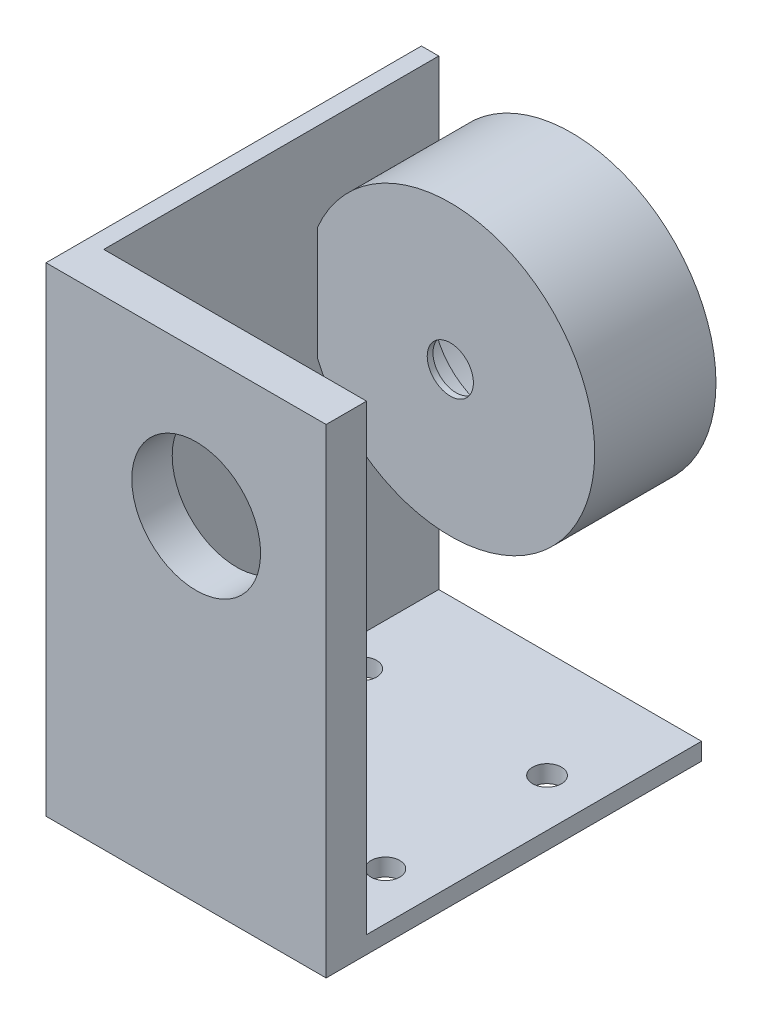
ISO-10303-21;
HEADER;
FILE_DESCRIPTION(('STEP AP214'),'2;1');
FILE_NAME('part.step','',(''),(''),'','','');
FILE_SCHEMA(('AUTOMOTIVE_DESIGN { 1 0 10303 214 1 1 1 1 }'));
ENDSEC;
DATA;
#1=APPLICATION_CONTEXT('core data for automotive mechanical design processes');
#2=APPLICATION_PROTOCOL_DEFINITION('international standard','automotive_design',2000,#1);
#3=PRODUCT_CONTEXT('',#1,'mechanical');
#4=PRODUCT('Part','Part','',(#3));
#5=PRODUCT_RELATED_PRODUCT_CATEGORY('part','',(#4));
#6=PRODUCT_DEFINITION_FORMATION('','',#4);
#7=PRODUCT_DEFINITION_CONTEXT('part definition',#1,'design');
#8=PRODUCT_DEFINITION('design','',#6,#7);
#9=PRODUCT_DEFINITION_SHAPE('','',#8);
#10=(LENGTH_UNIT() NAMED_UNIT(*) SI_UNIT(.MILLI.,.METRE.));
#11=(NAMED_UNIT(*) PLANE_ANGLE_UNIT() SI_UNIT($,.RADIAN.));
#12=(NAMED_UNIT(*) SI_UNIT($,.STERADIAN.) SOLID_ANGLE_UNIT());
#13=UNCERTAINTY_MEASURE_WITH_UNIT(LENGTH_MEASURE(1.E-05),#10,'distance_accuracy_value','');
#14=(GEOMETRIC_REPRESENTATION_CONTEXT(3) GLOBAL_UNCERTAINTY_ASSIGNED_CONTEXT((#13)) GLOBAL_UNIT_ASSIGNED_CONTEXT((#10,
#11,#12)) REPRESENTATION_CONTEXT('',''));
#15=CARTESIAN_POINT('',(0.,0.,0.));
#16=DIRECTION('',(0.,0.,1.));
#17=DIRECTION('',(1.,0.,0.));
#18=AXIS2_PLACEMENT_3D('',#15,#16,#17);
#19=CARTESIAN_POINT('',(-21.25,83.,25.5));
#20=DIRECTION('',(-1.,0.,0.));
#21=DIRECTION('',(0.,0.,1.));
#22=AXIS2_PLACEMENT_3D('',#19,#20,#21);
#23=PLANE('',#22);
#24=DIRECTION('',(0.,-1.,0.));
#25=VECTOR('',#24,1.);
#26=CARTESIAN_POINT('',(-21.25,67.7979589711327,-11.5));
#27=LINE('',#26,#25);
#28=CARTESIAN_POINT('',(-21.25,67.7979589711327,-11.5));
#29=VERTEX_POINT('',#28);
#30=CARTESIAN_POINT('',(-21.25,48.2020410288673,-11.5));
#31=VERTEX_POINT('',#30);
#32=EDGE_CURVE('E124',#29,#31,#27,.T.);
#33=ORIENTED_EDGE('',*,*,#32,.F.);
#34=DIRECTION('',(0.,0.,-1.));
#35=VECTOR('',#34,1.);
#36=CARTESIAN_POINT('',(-21.25,67.7979589711327,-19.5));
#37=LINE('',#36,#35);
#38=CARTESIAN_POINT('',(-21.25,67.7979589711327,-32.5));
#39=VERTEX_POINT('',#38);
#40=EDGE_CURVE('E111',#29,#39,#37,.T.);
#41=ORIENTED_EDGE('',*,*,#40,.T.);
#42=DIRECTION('',(0.,-1.,0.));
#43=VECTOR('',#42,1.);
#44=CARTESIAN_POINT('',(-21.25,83.,-32.5));
#45=LINE('',#44,#43);
#46=CARTESIAN_POINT('',(-21.25,83.,-32.5));
#47=VERTEX_POINT('',#46);
#48=EDGE_CURVE('E158',#47,#39,#45,.T.);
#49=ORIENTED_EDGE('',*,*,#48,.F.);
#50=DIRECTION('',(0.,0.,-1.));
#51=VECTOR('',#50,1.);
#52=CARTESIAN_POINT('',(-21.25,83.,25.5));
#53=LINE('',#52,#51);
#54=CARTESIAN_POINT('',(-21.25,83.,25.5));
#55=VERTEX_POINT('',#54);
#56=EDGE_CURVE('E152',#55,#47,#53,.T.);
#57=ORIENTED_EDGE('',*,*,#56,.F.);
#58=DIRECTION('',(0.,-1.,0.));
#59=VECTOR('',#58,1.);
#60=CARTESIAN_POINT('',(-21.25,83.,25.5));
#61=LINE('',#60,#59);
#62=CARTESIAN_POINT('',(-21.25,3.,25.5));
#63=VERTEX_POINT('',#62);
#64=EDGE_CURVE('E160',#55,#63,#61,.T.);
#65=ORIENTED_EDGE('',*,*,#64,.T.);
#66=DIRECTION('',(0.,0.,-1.));
#67=VECTOR('',#66,1.);
#68=CARTESIAN_POINT('',(-21.25,3.,25.5));
#69=LINE('',#68,#67);
#70=CARTESIAN_POINT('',(-21.25,3.,-32.5));
#71=VERTEX_POINT('',#70);
#72=EDGE_CURVE('E142',#63,#71,#69,.T.);
#73=ORIENTED_EDGE('',*,*,#72,.T.);
#74=CARTESIAN_POINT('',(-21.25,48.2020410288673,-32.5));
#75=VERTEX_POINT('',#74);
#76=EDGE_CURVE('E60',#75,#71,#45,.T.);
#77=ORIENTED_EDGE('',*,*,#76,.F.);
#78=DIRECTION('',(0.,0.,-1.));
#79=VECTOR('',#78,1.);
#80=CARTESIAN_POINT('',(-21.25,48.2020410288673,-19.5));
#81=LINE('',#80,#79);
#82=EDGE_CURVE('E119',#31,#75,#81,.T.);
#83=ORIENTED_EDGE('',*,*,#82,.F.);
#84=EDGE_LOOP('',(#33,#41,#49,#57,#65,#73,#77,#83));
#85=FACE_BOUND('',#84,.T.);
#86=ADVANCED_FACE('F39',(#85),#23,.F.);
#87=CARTESIAN_POINT('',(0.,3.,0.));
#88=DIRECTION('',(0.,-1.,0.));
#89=DIRECTION('',(0.,0.,-1.));
#90=AXIS2_PLACEMENT_3D('',#87,#88,#89);
#91=PLANE('',#90);
#92=CARTESIAN_POINT('',(-16.,3.,14.));
#93=DIRECTION('',(0.,1.,0.));
#94=DIRECTION('',(0.,0.,-1.));
#95=AXIS2_PLACEMENT_3D('',#92,#93,#94);
#96=CIRCLE('',#95,2.5);
#97=CARTESIAN_POINT('',(-16.,3.,11.5));
#98=VERTEX_POINT('',#97);
#99=EDGE_CURVE('E167',#98,#98,#96,.T.);
#100=ORIENTED_EDGE('',*,*,#99,.F.);
#101=EDGE_LOOP('',(#100));
#102=FACE_BOUND('',#101,.T.);
#103=CARTESIAN_POINT('',(16.,3.,14.));
#104=DIRECTION('',(0.,1.,0.));
#105=DIRECTION('',(0.,0.,1.));
#106=AXIS2_PLACEMENT_3D('',#103,#104,#105);
#107=CIRCLE('',#106,2.5);
#108=CARTESIAN_POINT('',(16.,3.,16.5));
#109=VERTEX_POINT('',#108);
#110=EDGE_CURVE('E173',#109,#109,#107,.T.);
#111=ORIENTED_EDGE('',*,*,#110,.F.);
#112=EDGE_LOOP('',(#111));
#113=FACE_BOUND('',#112,.T.);
#114=CARTESIAN_POINT('',(16.,3.,-14.));
#115=DIRECTION('',(0.,1.,0.));
#116=DIRECTION('',(0.,0.,-1.));
#117=AXIS2_PLACEMENT_3D('',#114,#115,#116);
#118=CIRCLE('',#117,2.5);
#119=CARTESIAN_POINT('',(16.,3.,-16.5));
#120=VERTEX_POINT('',#119);
#121=EDGE_CURVE('E179',#120,#120,#118,.T.);
#122=ORIENTED_EDGE('',*,*,#121,.F.);
#123=EDGE_LOOP('',(#122));
#124=FACE_BOUND('',#123,.T.);
#125=CARTESIAN_POINT('',(-16.,3.,-14.));
#126=DIRECTION('',(0.,1.,0.));
#127=DIRECTION('',(0.,0.,1.));
#128=AXIS2_PLACEMENT_3D('',#125,#126,#127);
#129=CIRCLE('',#128,2.5);
#130=CARTESIAN_POINT('',(-16.,3.,-11.5));
#131=VERTEX_POINT('',#130);
#132=EDGE_CURVE('E185',#131,#131,#129,.T.);
#133=ORIENTED_EDGE('',*,*,#132,.F.);
#134=EDGE_LOOP('',(#133));
#135=FACE_BOUND('',#134,.T.);
#136=ORIENTED_EDGE('',*,*,#72,.F.);
#137=DIRECTION('',(-1.,0.,0.));
#138=VECTOR('',#137,1.);
#139=CARTESIAN_POINT('',(24.25,3.,25.5));
#140=LINE('',#139,#138);
#141=CARTESIAN_POINT('',(24.25,3.,25.5));
#142=VERTEX_POINT('',#141);
#143=EDGE_CURVE('E118',#142,#63,#140,.T.);
#144=ORIENTED_EDGE('',*,*,#143,.F.);
#145=DIRECTION('',(0.,0.,-1.));
#146=VECTOR('',#145,1.);
#147=CARTESIAN_POINT('',(24.25,3.,32.5));
#148=LINE('',#147,#146);
#149=CARTESIAN_POINT('',(24.25,3.,-32.5));
#150=VERTEX_POINT('',#149);
#151=EDGE_CURVE('E191',#142,#150,#148,.T.);
#152=ORIENTED_EDGE('',*,*,#151,.T.);
#153=DIRECTION('',(-1.,0.,0.));
#154=VECTOR('',#153,1.);
#155=CARTESIAN_POINT('',(-24.25,3.,-32.5));
#156=LINE('',#155,#154);
#157=EDGE_CURVE('E193',#150,#71,#156,.T.);
#158=ORIENTED_EDGE('',*,*,#157,.T.);
#159=EDGE_LOOP('',(#136,#144,#152,#158));
#160=FACE_BOUND('',#159,.T.);
#161=ADVANCED_FACE('F238',(#102,#113,#124,#135,#160),#91,.F.);
#162=CARTESIAN_POINT('',(0.,0.,0.));
#163=DIRECTION('',(0.,-1.,0.));
#164=DIRECTION('',(0.,0.,-1.));
#165=AXIS2_PLACEMENT_3D('',#162,#163,#164);
#166=PLANE('',#165);
#167=CARTESIAN_POINT('',(16.,0.,14.));
#168=DIRECTION('',(0.,1.,0.));
#169=DIRECTION('',(0.,0.,1.));
#170=AXIS2_PLACEMENT_3D('',#167,#168,#169);
#171=CIRCLE('',#170,2.5);
#172=CARTESIAN_POINT('',(16.,0.,16.5));
#173=VERTEX_POINT('',#172);
#174=EDGE_CURVE('E170',#173,#173,#171,.T.);
#175=ORIENTED_EDGE('',*,*,#174,.T.);
#176=EDGE_LOOP('',(#175));
#177=FACE_BOUND('',#176,.T.);
#178=CARTESIAN_POINT('',(-16.,0.,-14.));
#179=DIRECTION('',(0.,1.,0.));
#180=DIRECTION('',(0.,0.,1.));
#181=AXIS2_PLACEMENT_3D('',#178,#179,#180);
#182=CIRCLE('',#181,2.5);
#183=CARTESIAN_POINT('',(-16.,0.,-11.5));
#184=VERTEX_POINT('',#183);
#185=EDGE_CURVE('E182',#184,#184,#182,.T.);
#186=ORIENTED_EDGE('',*,*,#185,.T.);
#187=EDGE_LOOP('',(#186));
#188=FACE_BOUND('',#187,.T.);
#189=DIRECTION('',(0.,0.,-1.));
#190=VECTOR('',#189,1.);
#191=CARTESIAN_POINT('',(24.25,0.,32.5));
#192=LINE('',#191,#190);
#193=CARTESIAN_POINT('',(24.25,0.,32.5));
#194=VERTEX_POINT('',#193);
#195=CARTESIAN_POINT('',(24.25,0.,-32.5));
#196=VERTEX_POINT('',#195);
#197=EDGE_CURVE('E188',#194,#196,#192,.T.);
#198=ORIENTED_EDGE('',*,*,#197,.F.);
#199=DIRECTION('',(1.,0.,0.));
#200=VECTOR('',#199,1.);
#201=CARTESIAN_POINT('',(-24.25,0.,32.5));
#202=LINE('',#201,#200);
#203=CARTESIAN_POINT('',(-24.25,0.,32.5));
#204=VERTEX_POINT('',#203);
#205=EDGE_CURVE('E194',#204,#194,#202,.T.);
#206=ORIENTED_EDGE('',*,*,#205,.F.);
#207=DIRECTION('',(0.,0.,1.));
#208=VECTOR('',#207,1.);
#209=CARTESIAN_POINT('',(-24.25,0.,32.5));
#210=LINE('',#209,#208);
#211=CARTESIAN_POINT('',(-24.25,0.,-32.5));
#212=VERTEX_POINT('',#211);
#213=EDGE_CURVE('E201',#212,#204,#210,.T.);
#214=ORIENTED_EDGE('',*,*,#213,.F.);
#215=DIRECTION('',(-1.,0.,0.));
#216=VECTOR('',#215,1.);
#217=CARTESIAN_POINT('',(-24.25,0.,-32.5));
#218=LINE('',#217,#216);
#219=EDGE_CURVE('E199',#196,#212,#218,.T.);
#220=ORIENTED_EDGE('',*,*,#219,.F.);
#221=EDGE_LOOP('',(#198,#206,#214,#220));
#222=FACE_BOUND('',#221,.T.);
#223=CARTESIAN_POINT('',(16.,0.,-14.));
#224=DIRECTION('',(0.,1.,0.));
#225=DIRECTION('',(0.,0.,-1.));
#226=AXIS2_PLACEMENT_3D('',#223,#224,#225);
#227=CIRCLE('',#226,2.5);
#228=CARTESIAN_POINT('',(16.,0.,-16.5));
#229=VERTEX_POINT('',#228);
#230=EDGE_CURVE('E176',#229,#229,#227,.T.);
#231=ORIENTED_EDGE('',*,*,#230,.T.);
#232=EDGE_LOOP('',(#231));
#233=FACE_BOUND('',#232,.T.);
#234=CARTESIAN_POINT('',(-16.,0.,14.));
#235=DIRECTION('',(0.,1.,0.));
#236=DIRECTION('',(0.,0.,-1.));
#237=AXIS2_PLACEMENT_3D('',#234,#235,#236);
#238=CIRCLE('',#237,2.5);
#239=CARTESIAN_POINT('',(-16.,0.,11.5));
#240=VERTEX_POINT('',#239);
#241=EDGE_CURVE('E166',#240,#240,#238,.T.);
#242=ORIENTED_EDGE('',*,*,#241,.T.);
#243=EDGE_LOOP('',(#242));
#244=FACE_BOUND('',#243,.T.);
#245=ADVANCED_FACE('F218',(#177,#188,#222,#233,#244),#166,.T.);
#246=CARTESIAN_POINT('',(24.25,3.,32.5));
#247=DIRECTION('',(-1.,0.,0.));
#248=DIRECTION('',(0.,0.,1.));
#249=AXIS2_PLACEMENT_3D('',#246,#247,#248);
#250=PLANE('',#249);
#251=ORIENTED_EDGE('',*,*,#197,.T.);
#252=DIRECTION('',(0.,-1.,0.));
#253=VECTOR('',#252,1.);
#254=CARTESIAN_POINT('',(24.25,3.,-32.5));
#255=LINE('',#254,#253);
#256=EDGE_CURVE('E11',#150,#196,#255,.T.);
#257=ORIENTED_EDGE('',*,*,#256,.F.);
#258=ORIENTED_EDGE('',*,*,#151,.F.);
#259=DIRECTION('',(0.,-1.,0.));
#260=VECTOR('',#259,1.);
#261=CARTESIAN_POINT('',(24.25,83.,25.5));
#262=LINE('',#261,#260);
#263=CARTESIAN_POINT('',(24.25,83.,25.5));
#264=VERTEX_POINT('',#263);
#265=EDGE_CURVE('E163',#264,#142,#262,.T.);
#266=ORIENTED_EDGE('',*,*,#265,.F.);
#267=DIRECTION('',(0.,0.,-1.));
#268=VECTOR('',#267,1.);
#269=CARTESIAN_POINT('',(24.25,83.,25.5));
#270=LINE('',#269,#268);
#271=CARTESIAN_POINT('',(24.25,83.,32.5));
#272=VERTEX_POINT('',#271);
#273=EDGE_CURVE('E148',#272,#264,#270,.T.);
#274=ORIENTED_EDGE('',*,*,#273,.F.);
#275=DIRECTION('',(0.,-1.,0.));
#276=VECTOR('',#275,1.);
#277=CARTESIAN_POINT('',(24.25,3.,32.5));
#278=LINE('',#277,#276);
#279=EDGE_CURVE('E196',#272,#194,#278,.T.);
#280=ORIENTED_EDGE('',*,*,#279,.T.);
#281=EDGE_LOOP('',(#251,#257,#258,#266,#274,#280));
#282=FACE_BOUND('',#281,.T.);
#283=ADVANCED_FACE('F41',(#282),#250,.F.);
#284=CARTESIAN_POINT('',(-24.25,3.,-32.5));
#285=DIRECTION('',(0.,0.,1.));
#286=DIRECTION('',(1.,0.,0.));
#287=AXIS2_PLACEMENT_3D('',#284,#285,#286);
#288=PLANE('',#287);
#289=ORIENTED_EDGE('',*,*,#219,.T.);
#290=DIRECTION('',(0.,-1.,0.));
#291=VECTOR('',#290,1.);
#292=CARTESIAN_POINT('',(-24.25,3.,-32.5));
#293=LINE('',#292,#291);
#294=CARTESIAN_POINT('',(-24.25,83.,-32.5));
#295=VERTEX_POINT('',#294);
#296=EDGE_CURVE('E48',#295,#212,#293,.T.);
#297=ORIENTED_EDGE('',*,*,#296,.F.);
#298=DIRECTION('',(-1.,0.,0.));
#299=VECTOR('',#298,1.);
#300=CARTESIAN_POINT('',(-21.25,83.,-32.5));
#301=LINE('',#300,#299);
#302=EDGE_CURVE('E138',#47,#295,#301,.T.);
#303=ORIENTED_EDGE('',*,*,#302,.F.);
#304=ORIENTED_EDGE('',*,*,#48,.T.);
#305=CARTESIAN_POINT('',(1.75,58.,-32.5));
#306=DIRECTION('',(0.,0.,-1.));
#307=DIRECTION('',(-1.,0.,0.));
#308=AXIS2_PLACEMENT_3D('',#305,#306,#307);
#309=CIRCLE('',#308,25.);
#310=EDGE_CURVE('E55',#39,#75,#309,.T.);
#311=ORIENTED_EDGE('',*,*,#310,.T.);
#312=ORIENTED_EDGE('',*,*,#76,.T.);
#313=ORIENTED_EDGE('',*,*,#157,.F.);
#314=ORIENTED_EDGE('',*,*,#256,.T.);
#315=EDGE_LOOP('',(#289,#297,#303,#304,#311,#312,#313,#314));
#316=FACE_BOUND('',#315,.T.);
#317=CARTESIAN_POINT('',(1.75,58.,-32.5));
#318=DIRECTION('',(0.,0.,-1.));
#319=DIRECTION('',(-1.,0.,0.));
#320=AXIS2_PLACEMENT_3D('',#317,#318,#319);
#321=CIRCLE('',#320,22.5);
#322=CARTESIAN_POINT('',(-20.75,58.,-32.5));
#323=VERTEX_POINT('',#322);
#324=EDGE_CURVE('E127',#323,#323,#321,.T.);
#325=ORIENTED_EDGE('',*,*,#324,.F.);
#326=EDGE_LOOP('',(#325));
#327=FACE_BOUND('',#326,.T.);
#328=ADVANCED_FACE('F233',(#316,#327),#288,.F.);
#329=CARTESIAN_POINT('',(-24.25,3.,32.5));
#330=DIRECTION('',(1.,0.,0.));
#331=DIRECTION('',(0.,0.,-1.));
#332=AXIS2_PLACEMENT_3D('',#329,#330,#331);
#333=PLANE('',#332);
#334=ORIENTED_EDGE('',*,*,#213,.T.);
#335=DIRECTION('',(0.,-1.,0.));
#336=VECTOR('',#335,1.);
#337=CARTESIAN_POINT('',(-24.25,3.,32.5));
#338=LINE('',#337,#336);
#339=CARTESIAN_POINT('',(-24.25,83.,32.5));
#340=VERTEX_POINT('',#339);
#341=EDGE_CURVE('E206',#340,#204,#338,.T.);
#342=ORIENTED_EDGE('',*,*,#341,.F.);
#343=DIRECTION('',(0.,0.,1.));
#344=VECTOR('',#343,1.);
#345=CARTESIAN_POINT('',(-24.25,83.,-32.5));
#346=LINE('',#345,#344);
#347=EDGE_CURVE('E141',#295,#340,#346,.T.);
#348=ORIENTED_EDGE('',*,*,#347,.F.);
#349=ORIENTED_EDGE('',*,*,#296,.T.);
#350=EDGE_LOOP('',(#334,#342,#348,#349));
#351=FACE_BOUND('',#350,.T.);
#352=ADVANCED_FACE('F213',(#351),#333,.F.);
#353=CARTESIAN_POINT('',(-24.25,3.,32.5));
#354=DIRECTION('',(0.,0.,-1.));
#355=DIRECTION('',(-1.,0.,0.));
#356=AXIS2_PLACEMENT_3D('',#353,#354,#355);
#357=PLANE('',#356);
#358=CARTESIAN_POINT('',(1.75,58.,32.5));
#359=DIRECTION('',(0.,0.,-1.));
#360=DIRECTION('',(-1.,0.,0.));
#361=AXIS2_PLACEMENT_3D('',#358,#359,#360);
#362=CIRCLE('',#361,11.15);
#363=CARTESIAN_POINT('',(-9.4,58.,32.5));
#364=VERTEX_POINT('',#363);
#365=EDGE_CURVE('E468',#364,#364,#362,.T.);
#366=ORIENTED_EDGE('',*,*,#365,.T.);
#367=EDGE_LOOP('',(#366));
#368=FACE_BOUND('',#367,.T.);
#369=ORIENTED_EDGE('',*,*,#205,.T.);
#370=ORIENTED_EDGE('',*,*,#279,.F.);
#371=DIRECTION('',(1.,0.,0.));
#372=VECTOR('',#371,1.);
#373=CARTESIAN_POINT('',(-24.25,83.,32.5));
#374=LINE('',#373,#372);
#375=EDGE_CURVE('E145',#340,#272,#374,.T.);
#376=ORIENTED_EDGE('',*,*,#375,.F.);
#377=ORIENTED_EDGE('',*,*,#341,.T.);
#378=EDGE_LOOP('',(#369,#370,#376,#377));
#379=FACE_BOUND('',#378,.T.);
#380=ADVANCED_FACE('F221',(#368,#379),#357,.F.);
#381=CARTESIAN_POINT('',(-16.,3.,-14.));
#382=DIRECTION('',(0.,-1.,0.));
#383=DIRECTION('',(0.,0.,-1.));
#384=AXIS2_PLACEMENT_3D('',#381,#382,#383);
#385=CYLINDRICAL_SURFACE('',#384,2.5);
#386=ORIENTED_EDGE('',*,*,#132,.T.);
#387=EDGE_LOOP('',(#386));
#388=FACE_BOUND('',#387,.T.);
#389=ORIENTED_EDGE('',*,*,#185,.F.);
#390=EDGE_LOOP('',(#389));
#391=FACE_BOUND('',#390,.T.);
#392=ADVANCED_FACE('F254',(#388,#391),#385,.F.);
#393=CARTESIAN_POINT('',(16.,3.,-14.));
#394=DIRECTION('',(0.,-1.,0.));
#395=DIRECTION('',(0.,0.,-1.));
#396=AXIS2_PLACEMENT_3D('',#393,#394,#395);
#397=CYLINDRICAL_SURFACE('',#396,2.5);
#398=ORIENTED_EDGE('',*,*,#121,.T.);
#399=EDGE_LOOP('',(#398));
#400=FACE_BOUND('',#399,.T.);
#401=ORIENTED_EDGE('',*,*,#230,.F.);
#402=EDGE_LOOP('',(#401));
#403=FACE_BOUND('',#402,.T.);
#404=ADVANCED_FACE('F402',(#400,#403),#397,.F.);
#405=CARTESIAN_POINT('',(16.,3.,14.));
#406=DIRECTION('',(0.,-1.,0.));
#407=DIRECTION('',(0.,0.,-1.));
#408=AXIS2_PLACEMENT_3D('',#405,#406,#407);
#409=CYLINDRICAL_SURFACE('',#408,2.5);
#410=ORIENTED_EDGE('',*,*,#110,.T.);
#411=EDGE_LOOP('',(#410));
#412=FACE_BOUND('',#411,.T.);
#413=ORIENTED_EDGE('',*,*,#174,.F.);
#414=EDGE_LOOP('',(#413));
#415=FACE_BOUND('',#414,.T.);
#416=ADVANCED_FACE('F411',(#412,#415),#409,.F.);
#417=CARTESIAN_POINT('',(-16.,3.,14.));
#418=DIRECTION('',(0.,-1.,0.));
#419=DIRECTION('',(0.,0.,-1.));
#420=AXIS2_PLACEMENT_3D('',#417,#418,#419);
#421=CYLINDRICAL_SURFACE('',#420,2.5);
#422=ORIENTED_EDGE('',*,*,#99,.T.);
#423=EDGE_LOOP('',(#422));
#424=FACE_BOUND('',#423,.T.);
#425=ORIENTED_EDGE('',*,*,#241,.F.);
#426=EDGE_LOOP('',(#425));
#427=FACE_BOUND('',#426,.T.);
#428=ADVANCED_FACE('F376',(#424,#427),#421,.F.);
#429=CARTESIAN_POINT('',(24.25,83.,25.5));
#430=DIRECTION('',(0.,0.,1.));
#431=DIRECTION('',(1.,0.,0.));
#432=AXIS2_PLACEMENT_3D('',#429,#430,#431);
#433=PLANE('',#432);
#434=CARTESIAN_POINT('',(1.75,58.,25.5));
#435=DIRECTION('',(0.,0.,-1.));
#436=DIRECTION('',(-1.,0.,0.));
#437=AXIS2_PLACEMENT_3D('',#434,#435,#436);
#438=CIRCLE('',#437,11.15);
#439=CARTESIAN_POINT('',(-9.40000000000001,58.,25.5));
#440=VERTEX_POINT('',#439);
#441=EDGE_CURVE('E467',#440,#440,#438,.T.);
#442=ORIENTED_EDGE('',*,*,#441,.F.);
#443=EDGE_LOOP('',(#442));
#444=FACE_BOUND('',#443,.T.);
#445=ORIENTED_EDGE('',*,*,#143,.T.);
#446=ORIENTED_EDGE('',*,*,#64,.F.);
#447=DIRECTION('',(-1.,0.,0.));
#448=VECTOR('',#447,1.);
#449=CARTESIAN_POINT('',(24.25,83.,25.5));
#450=LINE('',#449,#448);
#451=EDGE_CURVE('E150',#264,#55,#450,.T.);
#452=ORIENTED_EDGE('',*,*,#451,.F.);
#453=ORIENTED_EDGE('',*,*,#265,.T.);
#454=EDGE_LOOP('',(#445,#446,#452,#453));
#455=FACE_BOUND('',#454,.T.);
#456=ADVANCED_FACE('F236',(#444,#455),#433,.F.);
#457=CARTESIAN_POINT('',(0.,83.,0.));
#458=DIRECTION('',(0.,1.,0.));
#459=DIRECTION('',(0.,0.,1.));
#460=AXIS2_PLACEMENT_3D('',#457,#458,#459);
#461=PLANE('',#460);
#462=ORIENTED_EDGE('',*,*,#302,.T.);
#463=ORIENTED_EDGE('',*,*,#347,.T.);
#464=ORIENTED_EDGE('',*,*,#375,.T.);
#465=ORIENTED_EDGE('',*,*,#273,.T.);
#466=ORIENTED_EDGE('',*,*,#451,.T.);
#467=ORIENTED_EDGE('',*,*,#56,.T.);
#468=EDGE_LOOP('',(#462,#463,#464,#465,#466,#467));
#469=FACE_BOUND('',#468,.T.);
#470=ADVANCED_FACE('F230',(#469),#461,.T.);
#471=CARTESIAN_POINT('',(1.75,58.,-19.5));
#472=DIRECTION('',(0.,0.,-1.));
#473=DIRECTION('',(-1.,0.,0.));
#474=AXIS2_PLACEMENT_3D('',#471,#472,#473);
#475=CYLINDRICAL_SURFACE('',#474,25.);
#476=ORIENTED_EDGE('',*,*,#310,.F.);
#477=ORIENTED_EDGE('',*,*,#40,.F.);
#478=CARTESIAN_POINT('',(1.75000000000001,58.,-11.5));
#479=DIRECTION('',(0.,0.,1.));
#480=DIRECTION('',(-1.,0.,0.));
#481=AXIS2_PLACEMENT_3D('',#478,#479,#480);
#482=CIRCLE('',#481,25.);
#483=EDGE_CURVE('E114',#31,#29,#482,.T.);
#484=ORIENTED_EDGE('',*,*,#483,.F.);
#485=ORIENTED_EDGE('',*,*,#82,.T.);
#486=EDGE_LOOP('',(#476,#477,#484,#485));
#487=FACE_BOUND('',#486,.T.);
#488=ADVANCED_FACE('F113',(#487),#475,.T.);
#489=CARTESIAN_POINT('',(1.75,58.,-19.5));
#490=DIRECTION('',(0.,0.,-1.));
#491=DIRECTION('',(-1.,0.,0.));
#492=AXIS2_PLACEMENT_3D('',#489,#490,#491);
#493=CYLINDRICAL_SURFACE('',#492,22.5);
#494=CARTESIAN_POINT('',(1.75,58.,-19.5));
#495=DIRECTION('',(0.,0.,-1.));
#496=DIRECTION('',(-1.,0.,0.));
#497=AXIS2_PLACEMENT_3D('',#494,#495,#496);
#498=CIRCLE('',#497,22.5);
#499=CARTESIAN_POINT('',(-20.75,58.,-19.5));
#500=VERTEX_POINT('',#499);
#501=EDGE_CURVE('E130',#500,#500,#498,.T.);
#502=CARTESIAN_POINT('',(-20.75,58.,-19.5));
#503=CARTESIAN_POINT('',(-20.75,58.,-19.6354166666667));
#504=CARTESIAN_POINT('',(-20.75,58.,-19.7708333333333));
#505=CARTESIAN_POINT('',(-20.75,58.,-20.0416666666667));
#506=CARTESIAN_POINT('',(-20.75,58.,-20.1770833333333));
#507=CARTESIAN_POINT('',(-20.75,58.,-20.4479166666667));
#508=CARTESIAN_POINT('',(-20.75,58.,-20.5833333333333));
#509=CARTESIAN_POINT('',(-20.75,58.,-20.8541666666667));
#510=CARTESIAN_POINT('',(-20.75,58.,-20.9895833333333));
#511=CARTESIAN_POINT('',(-20.75,58.,-21.2604166666667));
#512=CARTESIAN_POINT('',(-20.75,58.,-21.3958333333333));
#513=CARTESIAN_POINT('',(-20.75,58.,-21.6666666666667));
#514=CARTESIAN_POINT('',(-20.75,58.,-21.8020833333333));
#515=CARTESIAN_POINT('',(-20.75,58.,-22.0729166666667));
#516=CARTESIAN_POINT('',(-20.75,58.,-22.2083333333333));
#517=CARTESIAN_POINT('',(-20.75,58.,-22.4791666666667));
#518=CARTESIAN_POINT('',(-20.75,58.,-22.6145833333333));
#519=CARTESIAN_POINT('',(-20.75,58.,-22.8854166666667));
#520=CARTESIAN_POINT('',(-20.75,58.,-23.0208333333333));
#521=CARTESIAN_POINT('',(-20.75,58.,-23.2916666666667));
#522=CARTESIAN_POINT('',(-20.75,58.,-23.4270833333333));
#523=CARTESIAN_POINT('',(-20.75,58.,-23.6979166666667));
#524=CARTESIAN_POINT('',(-20.75,58.,-23.8333333333333));
#525=CARTESIAN_POINT('',(-20.75,58.,-24.1041666666667));
#526=CARTESIAN_POINT('',(-20.75,58.,-24.2395833333333));
#527=CARTESIAN_POINT('',(-20.75,58.,-24.5104166666667));
#528=CARTESIAN_POINT('',(-20.75,58.,-24.6458333333333));
#529=CARTESIAN_POINT('',(-20.75,58.,-24.9166666666667));
#530=CARTESIAN_POINT('',(-20.75,58.,-25.0520833333333));
#531=CARTESIAN_POINT('',(-20.75,58.,-25.3229166666667));
#532=CARTESIAN_POINT('',(-20.75,58.,-25.4583333333333));
#533=CARTESIAN_POINT('',(-20.75,58.,-25.7291666666667));
#534=CARTESIAN_POINT('',(-20.75,58.,-25.8645833333333));
#535=CARTESIAN_POINT('',(-20.75,58.,-26.1354166666667));
#536=CARTESIAN_POINT('',(-20.75,58.,-26.2708333333333));
#537=CARTESIAN_POINT('',(-20.75,58.,-26.5416666666667));
#538=CARTESIAN_POINT('',(-20.75,58.,-26.6770833333333));
#539=CARTESIAN_POINT('',(-20.75,58.,-26.9479166666667));
#540=CARTESIAN_POINT('',(-20.75,58.,-27.0833333333333));
#541=CARTESIAN_POINT('',(-20.75,58.,-27.3541666666667));
#542=CARTESIAN_POINT('',(-20.75,58.,-27.4895833333333));
#543=CARTESIAN_POINT('',(-20.75,58.,-27.7604166666667));
#544=CARTESIAN_POINT('',(-20.75,58.,-27.8958333333333));
#545=CARTESIAN_POINT('',(-20.75,58.,-28.1666666666667));
#546=CARTESIAN_POINT('',(-20.75,58.,-28.3020833333333));
#547=CARTESIAN_POINT('',(-20.75,58.,-28.5729166666667));
#548=CARTESIAN_POINT('',(-20.75,58.,-28.7083333333333));
#549=CARTESIAN_POINT('',(-20.75,58.,-28.9791666666667));
#550=CARTESIAN_POINT('',(-20.75,58.,-29.1145833333333));
#551=CARTESIAN_POINT('',(-20.75,58.,-29.3854166666667));
#552=CARTESIAN_POINT('',(-20.75,58.,-29.5208333333333));
#553=CARTESIAN_POINT('',(-20.75,58.,-29.7916666666667));
#554=CARTESIAN_POINT('',(-20.75,58.,-29.9270833333333));
#555=CARTESIAN_POINT('',(-20.75,58.,-30.1979166666667));
#556=CARTESIAN_POINT('',(-20.75,58.,-30.3333333333333));
#557=CARTESIAN_POINT('',(-20.75,58.,-30.6041666666667));
#558=CARTESIAN_POINT('',(-20.75,58.,-30.7395833333333));
#559=CARTESIAN_POINT('',(-20.75,58.,-31.0104166666667));
#560=CARTESIAN_POINT('',(-20.75,58.,-31.1458333333333));
#561=CARTESIAN_POINT('',(-20.75,58.,-31.4166666666667));
#562=CARTESIAN_POINT('',(-20.75,58.,-31.5520833333333));
#563=CARTESIAN_POINT('',(-20.75,58.,-31.8229166666667));
#564=CARTESIAN_POINT('',(-20.75,58.,-31.9583333333333));
#565=CARTESIAN_POINT('',(-20.75,58.,-32.2291666666667));
#566=CARTESIAN_POINT('',(-20.75,58.,-32.3645833333333));
#567=CARTESIAN_POINT('',(-20.75,58.,-32.5));
#568=B_SPLINE_CURVE_WITH_KNOTS('',3,(#502,#503,#504,#505,#506,#507,#508,#509,#510,#511,#512,
#513,#514,#515,#516,#517,#518,#519,#520,#521,#522,#523,#524,#525,#526,#527,#528,#529,#530,#531,
#532,#533,#534,#535,#536,#537,#538,#539,#540,#541,#542,#543,#544,#545,#546,#547,#548,#549,#550,
#551,#552,#553,#554,#555,#556,#557,#558,#559,#560,#561,#562,#563,#564,#565,#566,#567),
.UNSPECIFIED.,.F.,.F.,(4,2,2,2,2,2,2,2,2,2,2,2,2,2,2,2,2,2,2,2,2,2,2,2,2,2,2,2,2,2,2,2,4),(0.,
0.406249999999997,0.812499999999997,1.21875,1.625,2.03125,2.4375,2.84375,3.25,3.65625,4.0625,
4.46875,4.875,5.28124999999999,5.68749999999999,6.09374999999999,6.5,6.90625,7.3125,7.71875,
8.12499999999999,8.53124999999999,8.93749999999999,9.34374999999999,9.74999999999999,10.15625,
10.5625,10.96875,11.375,11.78125,12.1875,12.59375,13.),.UNSPECIFIED.);
#569=EDGE_CURVE('BSEAM303',#500,#323,#568,.T.);
#570=ORIENTED_EDGE('',*,*,#501,.F.);
#571=ORIENTED_EDGE('',*,*,#324,.T.);
#572=ORIENTED_EDGE('',*,*,#569,.T.);
#573=ORIENTED_EDGE('',*,*,#569,.F.);
#574=EDGE_LOOP('',(#570,#572,#571,#573));
#575=FACE_BOUND('',#574,.T.);
#576=ADVANCED_FACE('F303',(#575),#493,.F.);
#577=CARTESIAN_POINT('',(1.75000000000001,58.,-19.5));
#578=DIRECTION('',(0.,0.,-1.));
#579=DIRECTION('',(-1.,0.,0.));
#580=AXIS2_PLACEMENT_3D('',#577,#578,#579);
#581=PLANE('',#580);
#582=CARTESIAN_POINT('',(1.75,58.,-19.5));
#583=DIRECTION('',(0.,0.,-1.));
#584=DIRECTION('',(-1.,0.,0.));
#585=AXIS2_PLACEMENT_3D('',#582,#583,#584);
#586=CIRCLE('',#585,11.1);
#587=CARTESIAN_POINT('',(-9.35,58.,-19.5));
#588=VERTEX_POINT('',#587);
#589=EDGE_CURVE('E477',#588,#588,#586,.T.);
#590=ORIENTED_EDGE('',*,*,#589,.F.);
#591=EDGE_LOOP('',(#590));
#592=FACE_BOUND('',#591,.T.);
#593=ORIENTED_EDGE('',*,*,#501,.T.);
#594=EDGE_LOOP('',(#593));
#595=FACE_BOUND('',#594,.T.);
#596=ADVANCED_FACE('F313',(#592,#595),#581,.T.);
#597=CARTESIAN_POINT('',(1.75000000000001,58.,-11.5));
#598=DIRECTION('',(0.,0.,-1.));
#599=DIRECTION('',(-1.,0.,0.));
#600=AXIS2_PLACEMENT_3D('',#597,#598,#599);
#601=PLANE('',#600);
#602=CARTESIAN_POINT('',(1.75,58.,-11.5));
#603=DIRECTION('',(0.,0.,-1.));
#604=DIRECTION('',(-1.,0.,0.));
#605=AXIS2_PLACEMENT_3D('',#602,#603,#604);
#606=CIRCLE('',#605,4.00000000000001);
#607=CARTESIAN_POINT('',(-2.25000000000001,58.,-11.5));
#608=VERTEX_POINT('',#607);
#609=EDGE_CURVE('E43',#608,#608,#606,.T.);
#610=ORIENTED_EDGE('',*,*,#609,.T.);
#611=EDGE_LOOP('',(#610));
#612=FACE_BOUND('',#611,.T.);
#613=ORIENTED_EDGE('',*,*,#483,.T.);
#614=ORIENTED_EDGE('',*,*,#32,.T.);
#615=EDGE_LOOP('',(#613,#614));
#616=FACE_BOUND('',#615,.T.);
#617=ADVANCED_FACE('F123',(#612,#616),#601,.F.);
#618=CARTESIAN_POINT('',(1.75,58.,-12.5));
#619=DIRECTION('',(0.,0.,-1.));
#620=DIRECTION('',(-1.,0.,0.));
#621=AXIS2_PLACEMENT_3D('',#618,#619,#620);
#622=CYLINDRICAL_SURFACE('',#621,11.1);
#623=CARTESIAN_POINT('',(1.75,58.,-12.5));
#624=DIRECTION('',(0.,0.,-1.));
#625=DIRECTION('',(-1.,0.,0.));
#626=AXIS2_PLACEMENT_3D('',#623,#624,#625);
#627=CIRCLE('',#626,11.1);
#628=CARTESIAN_POINT('',(-9.35,58.,-12.5));
#629=VERTEX_POINT('',#628);
#630=EDGE_CURVE('E125',#629,#629,#627,.T.);
#631=ORIENTED_EDGE('',*,*,#630,.F.);
#632=EDGE_LOOP('',(#631));
#633=FACE_BOUND('',#632,.T.);
#634=ORIENTED_EDGE('',*,*,#589,.T.);
#635=EDGE_LOOP('',(#634));
#636=FACE_BOUND('',#635,.T.);
#637=ADVANCED_FACE('F335',(#633,#636),#622,.F.);
#638=CARTESIAN_POINT('',(1.75,58.,-12.5));
#639=DIRECTION('',(0.,0.,-1.));
#640=DIRECTION('',(-1.,0.,0.));
#641=AXIS2_PLACEMENT_3D('',#638,#639,#640);
#642=PLANE('',#641);
#643=CARTESIAN_POINT('',(1.75,58.,-12.5));
#644=DIRECTION('',(0.,0.,-1.));
#645=DIRECTION('',(-1.,0.,0.));
#646=AXIS2_PLACEMENT_3D('',#643,#644,#645);
#647=CIRCLE('',#646,4.00000000000001);
#648=CARTESIAN_POINT('',(-2.25000000000001,58.,-12.5));
#649=VERTEX_POINT('',#648);
#650=EDGE_CURVE('E471',#649,#649,#647,.T.);
#651=ORIENTED_EDGE('',*,*,#650,.F.);
#652=EDGE_LOOP('',(#651));
#653=FACE_BOUND('',#652,.T.);
#654=ORIENTED_EDGE('',*,*,#630,.T.);
#655=EDGE_LOOP('',(#654));
#656=FACE_BOUND('',#655,.T.);
#657=ADVANCED_FACE('F344',(#653,#656),#642,.T.);
#658=CARTESIAN_POINT('',(1.75,58.,65.5));
#659=DIRECTION('',(0.,0.,-1.));
#660=DIRECTION('',(-1.,0.,0.));
#661=AXIS2_PLACEMENT_3D('',#658,#659,#660);
#662=CYLINDRICAL_SURFACE('',#661,4.00000000000001);
#663=ORIENTED_EDGE('',*,*,#650,.T.);
#664=EDGE_LOOP('',(#663));
#665=FACE_BOUND('',#664,.T.);
#666=ORIENTED_EDGE('',*,*,#609,.F.);
#667=EDGE_LOOP('',(#666));
#668=FACE_BOUND('',#667,.T.);
#669=ADVANCED_FACE('F353',(#665,#668),#662,.F.);
#670=CARTESIAN_POINT('',(1.75,58.,35.5));
#671=DIRECTION('',(0.,0.,-1.));
#672=DIRECTION('',(-1.,0.,0.));
#673=AXIS2_PLACEMENT_3D('',#670,#671,#672);
#674=CYLINDRICAL_SURFACE('',#673,11.15);
#675=ORIENTED_EDGE('',*,*,#441,.T.);
#676=EDGE_LOOP('',(#675));
#677=FACE_BOUND('',#676,.T.);
#678=ORIENTED_EDGE('',*,*,#365,.F.);
#679=EDGE_LOOP('',(#678));
#680=FACE_BOUND('',#679,.T.);
#681=ADVANCED_FACE('F362',(#677,#680),#674,.F.);
#682=CLOSED_SHELL('',(#86,#161,#245,#283,#328,#352,#380,#392,#404,#416,#428,#456,#470,#488,#576,
#596,#617,#637,#657,#669,#681));
#683=MANIFOLD_SOLID_BREP('B2',#682);
#684=ADVANCED_BREP_SHAPE_REPRESENTATION('',(#18,#683),#14);
#685=SHAPE_DEFINITION_REPRESENTATION(#9,#684);
ENDSEC;
END-ISO-10303-21;
